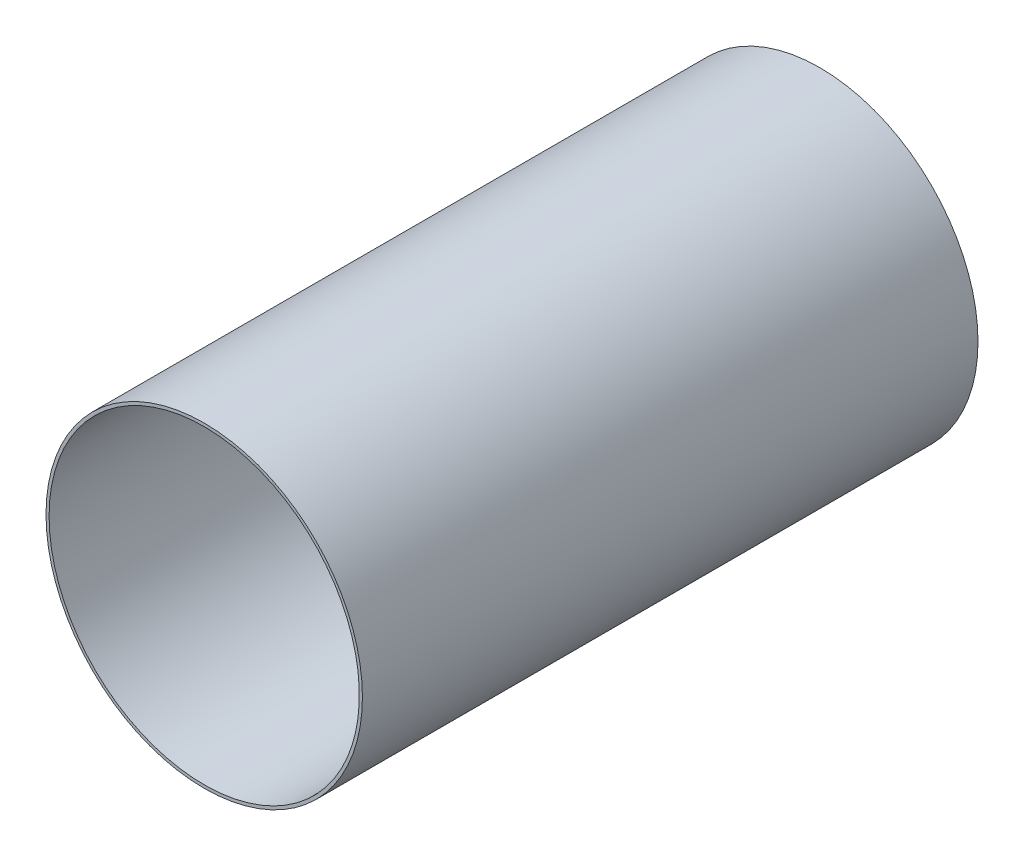
ISO-10303-21;
HEADER;
FILE_DESCRIPTION(('STEP AP214'),'2;1');
FILE_NAME('part.step','',(''),(''),'','','');
FILE_SCHEMA(('AUTOMOTIVE_DESIGN { 1 0 10303 214 1 1 1 1 }'));
ENDSEC;
DATA;
#1=APPLICATION_CONTEXT('core data for automotive mechanical design processes');
#2=APPLICATION_PROTOCOL_DEFINITION('international standard','automotive_design',2000,#1);
#3=PRODUCT_CONTEXT('',#1,'mechanical');
#4=PRODUCT('Part','Part','',(#3));
#5=PRODUCT_RELATED_PRODUCT_CATEGORY('part','',(#4));
#6=PRODUCT_DEFINITION_FORMATION('','',#4);
#7=PRODUCT_DEFINITION_CONTEXT('part definition',#1,'design');
#8=PRODUCT_DEFINITION('design','',#6,#7);
#9=PRODUCT_DEFINITION_SHAPE('','',#8);
#10=(LENGTH_UNIT() NAMED_UNIT(*) SI_UNIT(.MILLI.,.METRE.));
#11=(NAMED_UNIT(*) PLANE_ANGLE_UNIT() SI_UNIT($,.RADIAN.));
#12=(NAMED_UNIT(*) SI_UNIT($,.STERADIAN.) SOLID_ANGLE_UNIT());
#13=UNCERTAINTY_MEASURE_WITH_UNIT(LENGTH_MEASURE(1.E-05),#10,'distance_accuracy_value','');
#14=(GEOMETRIC_REPRESENTATION_CONTEXT(3) GLOBAL_UNCERTAINTY_ASSIGNED_CONTEXT((#13)) GLOBAL_UNIT_ASSIGNED_CONTEXT((#10,
#11,#12)) REPRESENTATION_CONTEXT('',''));
#15=CARTESIAN_POINT('',(0.,0.,0.));
#16=DIRECTION('',(0.,0.,1.));
#17=DIRECTION('',(1.,0.,0.));
#18=AXIS2_PLACEMENT_3D('',#15,#16,#17);
#19=CARTESIAN_POINT('',(0.,0.,0.));
#20=DIRECTION('',(0.,0.,1.));
#21=DIRECTION('',(1.,0.,0.));
#22=AXIS2_PLACEMENT_3D('',#19,#20,#21);
#23=CYLINDRICAL_SURFACE('',#22,257.);
#24=CARTESIAN_POINT('',(0.,0.,1000.));
#25=DIRECTION('',(0.,0.,1.));
#26=DIRECTION('',(1.,0.,0.));
#27=AXIS2_PLACEMENT_3D('',#24,#25,#26);
#28=CIRCLE('',#27,257.);
#29=CARTESIAN_POINT('',(-257.,0.,1000.));
#30=VERTEX_POINT('',#29);
#31=EDGE_CURVE('E27',#30,#30,#28,.T.);
#32=ORIENTED_EDGE('',*,*,#31,.F.);
#33=DIRECTION('',(0.,0.,-1.));
#34=VECTOR('',#33,1.);
#35=CARTESIAN_POINT('',(-257.,0.,0.));
#36=LINE('',#35,#34);
#37=CARTESIAN_POINT('',(-257.,0.,0.));
#38=VERTEX_POINT('',#37);
#39=EDGE_CURVE('E11',#30,#38,#36,.T.);
#40=ORIENTED_EDGE('',*,*,#39,.T.);
#41=CARTESIAN_POINT('',(0.,0.,0.));
#42=DIRECTION('',(0.,0.,1.));
#43=DIRECTION('',(1.,0.,0.));
#44=AXIS2_PLACEMENT_3D('',#41,#42,#43);
#45=CIRCLE('',#44,257.);
#46=EDGE_CURVE('E48',#38,#38,#45,.T.);
#47=ORIENTED_EDGE('',*,*,#46,.T.);
#48=ORIENTED_EDGE('',*,*,#39,.F.);
#49=EDGE_LOOP('',(#32,#40,#47,#48));
#50=FACE_BOUND('',#49,.T.);
#51=ADVANCED_FACE('F17',(#50),#23,.T.);
#52=CARTESIAN_POINT('',(0.,0.,1000.));
#53=DIRECTION('',(0.,0.,1.));
#54=DIRECTION('',(1.,0.,0.));
#55=AXIS2_PLACEMENT_3D('',#52,#53,#54);
#56=PLANE('',#55);
#57=CARTESIAN_POINT('',(0.,0.,1000.));
#58=DIRECTION('',(0.,0.,-1.));
#59=DIRECTION('',(1.,0.,0.));
#60=AXIS2_PLACEMENT_3D('',#57,#58,#59);
#61=CIRCLE('',#60,252.);
#62=CARTESIAN_POINT('',(-252.,0.,1000.));
#63=VERTEX_POINT('',#62);
#64=EDGE_CURVE('E51',#63,#63,#61,.T.);
#65=ORIENTED_EDGE('',*,*,#64,.T.);
#66=EDGE_LOOP('',(#65));
#67=FACE_BOUND('',#66,.T.);
#68=ORIENTED_EDGE('',*,*,#31,.T.);
#69=EDGE_LOOP('',(#68));
#70=FACE_BOUND('',#69,.T.);
#71=ADVANCED_FACE('F19',(#67,#70),#56,.T.);
#72=CARTESIAN_POINT('',(0.,0.,0.));
#73=DIRECTION('',(0.,0.,1.));
#74=DIRECTION('',(1.,0.,0.));
#75=AXIS2_PLACEMENT_3D('',#72,#73,#74);
#76=CYLINDRICAL_SURFACE('',#75,252.);
#77=CARTESIAN_POINT('',(0.,0.,0.));
#78=DIRECTION('',(0.,0.,-1.));
#79=DIRECTION('',(1.,0.,0.));
#80=AXIS2_PLACEMENT_3D('',#77,#78,#79);
#81=CIRCLE('',#80,252.);
#82=CARTESIAN_POINT('',(-252.,0.,0.));
#83=VERTEX_POINT('',#82);
#84=EDGE_CURVE('E61',#83,#83,#81,.T.);
#85=ORIENTED_EDGE('',*,*,#84,.T.);
#86=DIRECTION('',(0.,0.,1.));
#87=VECTOR('',#86,1.);
#88=CARTESIAN_POINT('',(-252.,0.,0.));
#89=LINE('',#88,#87);
#90=EDGE_CURVE('E57',#83,#63,#89,.T.);
#91=ORIENTED_EDGE('',*,*,#90,.T.);
#92=ORIENTED_EDGE('',*,*,#64,.F.);
#93=ORIENTED_EDGE('',*,*,#90,.F.);
#94=EDGE_LOOP('',(#85,#91,#92,#93));
#95=FACE_BOUND('',#94,.T.);
#96=ADVANCED_FACE('F76',(#95),#76,.F.);
#97=CARTESIAN_POINT('',(0.,0.,0.));
#98=DIRECTION('',(0.,0.,1.));
#99=DIRECTION('',(1.,0.,0.));
#100=AXIS2_PLACEMENT_3D('',#97,#98,#99);
#101=PLANE('',#100);
#102=ORIENTED_EDGE('',*,*,#84,.F.);
#103=EDGE_LOOP('',(#102));
#104=FACE_BOUND('',#103,.T.);
#105=ORIENTED_EDGE('',*,*,#46,.F.);
#106=EDGE_LOOP('',(#105));
#107=FACE_BOUND('',#106,.T.);
#108=ADVANCED_FACE('F84',(#104,#107),#101,.F.);
#109=CLOSED_SHELL('',(#51,#71,#96,#108));
#110=MANIFOLD_SOLID_BREP('B1',#109);
#111=ADVANCED_BREP_SHAPE_REPRESENTATION('',(#18,#110),#14);
#112=SHAPE_DEFINITION_REPRESENTATION(#9,#111);
ENDSEC;
END-ISO-10303-21;
